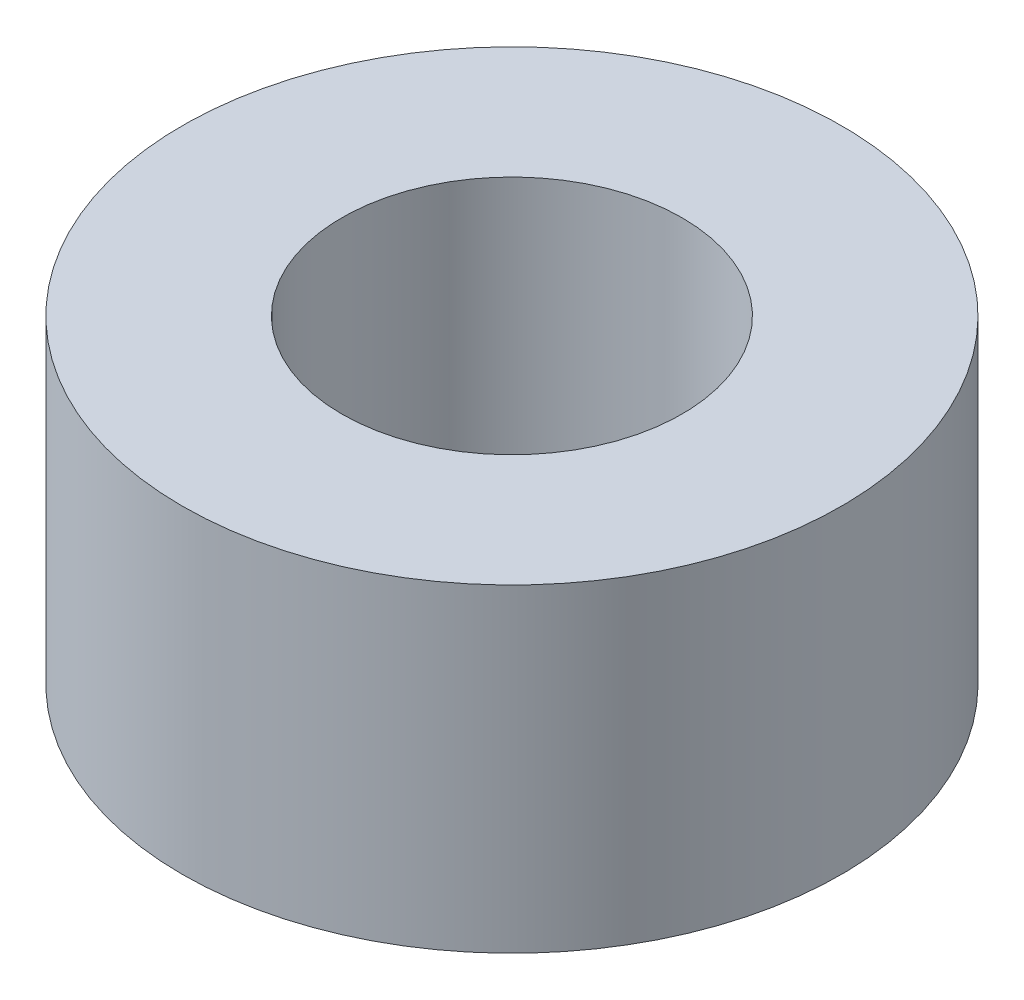
ISO-10303-21;
HEADER;
FILE_DESCRIPTION(('STEP AP214'),'2;1');
FILE_NAME('part.step','',(''),(''),'','','');
FILE_SCHEMA(('AUTOMOTIVE_DESIGN { 1 0 10303 214 1 1 1 1 }'));
ENDSEC;
DATA;
#1=APPLICATION_CONTEXT('core data for automotive mechanical design processes');
#2=APPLICATION_PROTOCOL_DEFINITION('international standard','automotive_design',2000,#1);
#3=PRODUCT_CONTEXT('',#1,'mechanical');
#4=PRODUCT('Part','Part','',(#3));
#5=PRODUCT_RELATED_PRODUCT_CATEGORY('part','',(#4));
#6=PRODUCT_DEFINITION_FORMATION('','',#4);
#7=PRODUCT_DEFINITION_CONTEXT('part definition',#1,'design');
#8=PRODUCT_DEFINITION('design','',#6,#7);
#9=PRODUCT_DEFINITION_SHAPE('','',#8);
#10=(LENGTH_UNIT() NAMED_UNIT(*) SI_UNIT(.MILLI.,.METRE.));
#11=(NAMED_UNIT(*) PLANE_ANGLE_UNIT() SI_UNIT($,.RADIAN.));
#12=(NAMED_UNIT(*) SI_UNIT($,.STERADIAN.) SOLID_ANGLE_UNIT());
#13=UNCERTAINTY_MEASURE_WITH_UNIT(LENGTH_MEASURE(1.E-05),#10,'distance_accuracy_value','');
#14=(GEOMETRIC_REPRESENTATION_CONTEXT(3) GLOBAL_UNCERTAINTY_ASSIGNED_CONTEXT((#13)) GLOBAL_UNIT_ASSIGNED_CONTEXT((#10,
#11,#12)) REPRESENTATION_CONTEXT('',''));
#15=CARTESIAN_POINT('',(0.,0.,0.));
#16=DIRECTION('',(0.,0.,1.));
#17=DIRECTION('',(1.,0.,0.));
#18=AXIS2_PLACEMENT_3D('',#15,#16,#17);
#19=CARTESIAN_POINT('',(0.,3.,0.));
#20=DIRECTION('',(0.,1.,0.));
#21=DIRECTION('',(0.,0.,1.));
#22=AXIS2_PLACEMENT_3D('',#19,#20,#21);
#23=PLANE('',#22);
#24=CARTESIAN_POINT('',(0.,3.,0.));
#25=DIRECTION('',(0.,1.,0.));
#26=DIRECTION('',(0.,0.,1.));
#27=AXIS2_PLACEMENT_3D('',#24,#25,#26);
#28=CIRCLE('',#27,3.1);
#29=CARTESIAN_POINT('',(0.,3.,3.1));
#30=VERTEX_POINT('',#29);
#31=EDGE_CURVE('E10',#30,#30,#28,.T.);
#32=ORIENTED_EDGE('',*,*,#31,.T.);
#33=EDGE_LOOP('',(#32));
#34=FACE_BOUND('',#33,.T.);
#35=CARTESIAN_POINT('',(0.,3.,0.));
#36=DIRECTION('',(0.,1.,0.));
#37=DIRECTION('',(0.,0.,1.));
#38=AXIS2_PLACEMENT_3D('',#35,#36,#37);
#39=CIRCLE('',#38,1.6);
#40=CARTESIAN_POINT('',(0.,3.,1.6));
#41=VERTEX_POINT('',#40);
#42=EDGE_CURVE('E47',#41,#41,#39,.T.);
#43=ORIENTED_EDGE('',*,*,#42,.F.);
#44=EDGE_LOOP('',(#43));
#45=FACE_BOUND('',#44,.T.);
#46=ADVANCED_FACE('F36',(#34,#45),#23,.T.);
#47=CARTESIAN_POINT('',(0.,0.,0.));
#48=DIRECTION('',(0.,1.,0.));
#49=DIRECTION('',(0.,0.,1.));
#50=AXIS2_PLACEMENT_3D('',#47,#48,#49);
#51=PLANE('',#50);
#52=CARTESIAN_POINT('',(0.,0.,0.));
#53=DIRECTION('',(0.,1.,0.));
#54=DIRECTION('',(0.,0.,1.));
#55=AXIS2_PLACEMENT_3D('',#52,#53,#54);
#56=CIRCLE('',#55,3.1);
#57=CARTESIAN_POINT('',(0.,0.,3.1));
#58=VERTEX_POINT('',#57);
#59=EDGE_CURVE('E40',#58,#58,#56,.T.);
#60=ORIENTED_EDGE('',*,*,#59,.F.);
#61=EDGE_LOOP('',(#60));
#62=FACE_BOUND('',#61,.T.);
#63=CARTESIAN_POINT('',(0.,0.,0.));
#64=DIRECTION('',(0.,1.,0.));
#65=DIRECTION('',(0.,0.,1.));
#66=AXIS2_PLACEMENT_3D('',#63,#64,#65);
#67=CIRCLE('',#66,1.6);
#68=CARTESIAN_POINT('',(0.,0.,1.6));
#69=VERTEX_POINT('',#68);
#70=EDGE_CURVE('E49',#69,#69,#67,.T.);
#71=ORIENTED_EDGE('',*,*,#70,.T.);
#72=EDGE_LOOP('',(#71));
#73=FACE_BOUND('',#72,.T.);
#74=ADVANCED_FACE('F60',(#62,#73),#51,.F.);
#75=CARTESIAN_POINT('',(0.,3.,0.));
#76=DIRECTION('',(0.,-1.,0.));
#77=DIRECTION('',(0.,0.,-1.));
#78=AXIS2_PLACEMENT_3D('',#75,#76,#77);
#79=CYLINDRICAL_SURFACE('',#78,3.1);
#80=ORIENTED_EDGE('',*,*,#31,.F.);
#81=EDGE_LOOP('',(#80));
#82=FACE_BOUND('',#81,.T.);
#83=ORIENTED_EDGE('',*,*,#59,.T.);
#84=EDGE_LOOP('',(#83));
#85=FACE_BOUND('',#84,.T.);
#86=ADVANCED_FACE('F38',(#82,#85),#79,.T.);
#87=CARTESIAN_POINT('',(0.,3.,0.));
#88=DIRECTION('',(0.,-1.,0.));
#89=DIRECTION('',(0.,0.,-1.));
#90=AXIS2_PLACEMENT_3D('',#87,#88,#89);
#91=CYLINDRICAL_SURFACE('',#90,1.6);
#92=ORIENTED_EDGE('',*,*,#42,.T.);
#93=EDGE_LOOP('',(#92));
#94=FACE_BOUND('',#93,.T.);
#95=ORIENTED_EDGE('',*,*,#70,.F.);
#96=EDGE_LOOP('',(#95));
#97=FACE_BOUND('',#96,.T.);
#98=ADVANCED_FACE('F56',(#94,#97),#91,.F.);
#99=CLOSED_SHELL('',(#46,#74,#86,#98));
#100=MANIFOLD_SOLID_BREP('B2',#99);
#101=ADVANCED_BREP_SHAPE_REPRESENTATION('',(#18,#100),#14);
#102=SHAPE_DEFINITION_REPRESENTATION(#9,#101);
ENDSEC;
END-ISO-10303-21;
